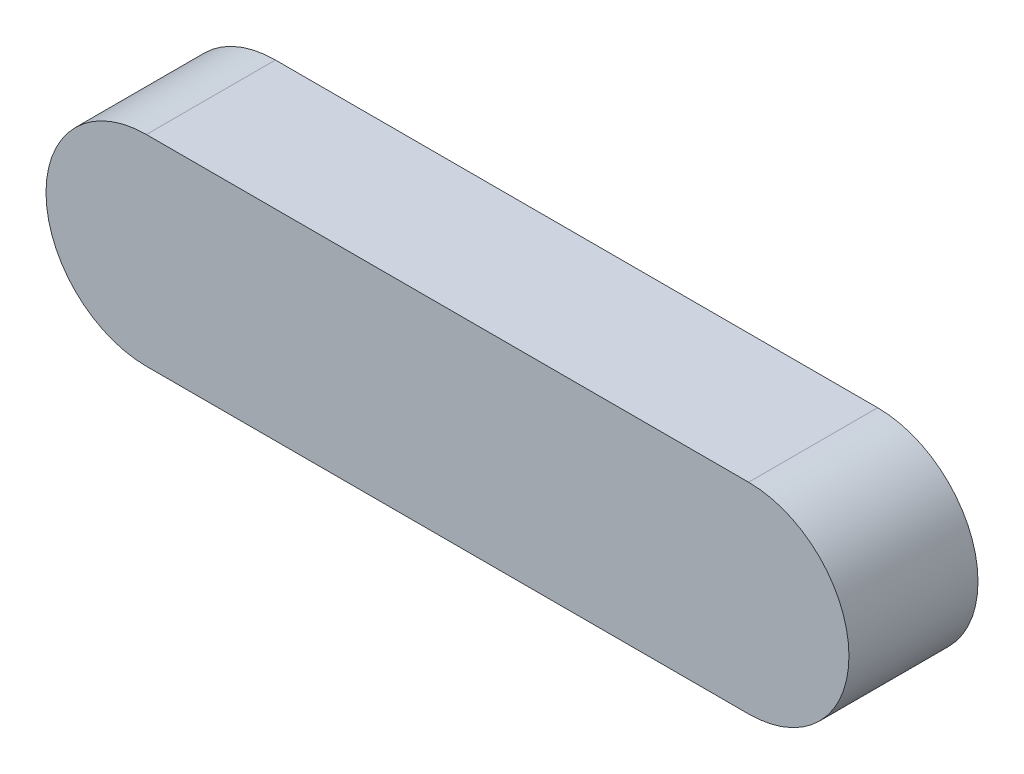
ISO-10303-21;
HEADER;
FILE_DESCRIPTION(('STEP AP214'),'2;1');
FILE_NAME('part.step','',(''),(''),'','','');
FILE_SCHEMA(('AUTOMOTIVE_DESIGN { 1 0 10303 214 1 1 1 1 }'));
ENDSEC;
DATA;
#1=APPLICATION_CONTEXT('core data for automotive mechanical design processes');
#2=APPLICATION_PROTOCOL_DEFINITION('international standard','automotive_design',2000,#1);
#3=PRODUCT_CONTEXT('',#1,'mechanical');
#4=PRODUCT('Part','Part','',(#3));
#5=PRODUCT_RELATED_PRODUCT_CATEGORY('part','',(#4));
#6=PRODUCT_DEFINITION_FORMATION('','',#4);
#7=PRODUCT_DEFINITION_CONTEXT('part definition',#1,'design');
#8=PRODUCT_DEFINITION('design','',#6,#7);
#9=PRODUCT_DEFINITION_SHAPE('','',#8);
#10=(LENGTH_UNIT() NAMED_UNIT(*) SI_UNIT(.MILLI.,.METRE.));
#11=(NAMED_UNIT(*) PLANE_ANGLE_UNIT() SI_UNIT($,.RADIAN.));
#12=(NAMED_UNIT(*) SI_UNIT($,.STERADIAN.) SOLID_ANGLE_UNIT());
#13=UNCERTAINTY_MEASURE_WITH_UNIT(LENGTH_MEASURE(1.E-05),#10,'distance_accuracy_value','');
#14=(GEOMETRIC_REPRESENTATION_CONTEXT(3) GLOBAL_UNCERTAINTY_ASSIGNED_CONTEXT((#13)) GLOBAL_UNIT_ASSIGNED_CONTEXT((#10,
#11,#12)) REPRESENTATION_CONTEXT('',''));
#15=CARTESIAN_POINT('',(0.,0.,0.));
#16=DIRECTION('',(0.,0.,1.));
#17=DIRECTION('',(1.,0.,0.));
#18=AXIS2_PLACEMENT_3D('',#15,#16,#17);
#19=CARTESIAN_POINT('',(-21.,0.,9.));
#20=DIRECTION('',(0.,0.,-1.));
#21=DIRECTION('',(-1.,0.,0.));
#22=AXIS2_PLACEMENT_3D('',#19,#20,#21);
#23=CYLINDRICAL_SURFACE('',#22,7.);
#24=CARTESIAN_POINT('',(-21.,0.,0.));
#25=DIRECTION('',(0.,0.,1.));
#26=DIRECTION('',(1.,0.,0.));
#27=AXIS2_PLACEMENT_3D('',#24,#25,#26);
#28=CIRCLE('',#27,7.);
#29=CARTESIAN_POINT('',(-21.,7.,0.));
#30=VERTEX_POINT('',#29);
#31=CARTESIAN_POINT('',(-21.,-7.,0.));
#32=VERTEX_POINT('',#31);
#33=EDGE_CURVE('E97',#30,#32,#28,.T.);
#34=ORIENTED_EDGE('',*,*,#33,.T.);
#35=DIRECTION('',(0.,0.,-1.));
#36=VECTOR('',#35,1.);
#37=CARTESIAN_POINT('',(-21.,-7.,9.));
#38=LINE('',#37,#36);
#39=CARTESIAN_POINT('',(-21.,-7.,9.));
#40=VERTEX_POINT('',#39);
#41=EDGE_CURVE('E11',#40,#32,#38,.T.);
#42=ORIENTED_EDGE('',*,*,#41,.F.);
#43=CARTESIAN_POINT('',(-21.,0.,9.));
#44=DIRECTION('',(0.,0.,1.));
#45=DIRECTION('',(1.,0.,0.));
#46=AXIS2_PLACEMENT_3D('',#43,#44,#45);
#47=CIRCLE('',#46,7.);
#48=CARTESIAN_POINT('',(-21.,7.,9.));
#49=VERTEX_POINT('',#48);
#50=EDGE_CURVE('E85',#49,#40,#47,.T.);
#51=ORIENTED_EDGE('',*,*,#50,.F.);
#52=DIRECTION('',(0.,0.,-1.));
#53=VECTOR('',#52,1.);
#54=CARTESIAN_POINT('',(-21.,7.,9.));
#55=LINE('',#54,#53);
#56=EDGE_CURVE('E93',#49,#30,#55,.T.);
#57=ORIENTED_EDGE('',*,*,#56,.T.);
#58=EDGE_LOOP('',(#34,#42,#51,#57));
#59=FACE_BOUND('',#58,.T.);
#60=ADVANCED_FACE('F34',(#59),#23,.T.);
#61=CARTESIAN_POINT('',(-21.,-7.,9.));
#62=DIRECTION('',(0.,1.,0.));
#63=DIRECTION('',(0.,0.,1.));
#64=AXIS2_PLACEMENT_3D('',#61,#62,#63);
#65=PLANE('',#64);
#66=DIRECTION('',(1.,0.,0.));
#67=VECTOR('',#66,1.);
#68=CARTESIAN_POINT('',(-21.,-7.,0.));
#69=LINE('',#68,#67);
#70=CARTESIAN_POINT('',(21.,-7.,0.));
#71=VERTEX_POINT('',#70);
#72=EDGE_CURVE('E89',#32,#71,#69,.T.);
#73=ORIENTED_EDGE('',*,*,#72,.T.);
#74=DIRECTION('',(0.,0.,-1.));
#75=VECTOR('',#74,1.);
#76=CARTESIAN_POINT('',(21.,-7.,9.));
#77=LINE('',#76,#75);
#78=CARTESIAN_POINT('',(21.,-7.,9.));
#79=VERTEX_POINT('',#78);
#80=EDGE_CURVE('E42',#79,#71,#77,.T.);
#81=ORIENTED_EDGE('',*,*,#80,.F.);
#82=DIRECTION('',(1.,0.,0.));
#83=VECTOR('',#82,1.);
#84=CARTESIAN_POINT('',(-21.,-7.,9.));
#85=LINE('',#84,#83);
#86=EDGE_CURVE('E80',#40,#79,#85,.T.);
#87=ORIENTED_EDGE('',*,*,#86,.F.);
#88=ORIENTED_EDGE('',*,*,#41,.T.);
#89=EDGE_LOOP('',(#73,#81,#87,#88));
#90=FACE_BOUND('',#89,.T.);
#91=ADVANCED_FACE('F88',(#90),#65,.F.);
#92=CARTESIAN_POINT('',(21.,0.,9.));
#93=DIRECTION('',(0.,0.,-1.));
#94=DIRECTION('',(-1.,0.,0.));
#95=AXIS2_PLACEMENT_3D('',#92,#93,#94);
#96=CYLINDRICAL_SURFACE('',#95,7.);
#97=CARTESIAN_POINT('',(21.,0.,0.));
#98=DIRECTION('',(0.,0.,1.));
#99=DIRECTION('',(1.,0.,0.));
#100=AXIS2_PLACEMENT_3D('',#97,#98,#99);
#101=CIRCLE('',#100,7.);
#102=CARTESIAN_POINT('',(21.,7.,0.));
#103=VERTEX_POINT('',#102);
#104=EDGE_CURVE('E67',#71,#103,#101,.T.);
#105=ORIENTED_EDGE('',*,*,#104,.T.);
#106=DIRECTION('',(0.,0.,-1.));
#107=VECTOR('',#106,1.);
#108=CARTESIAN_POINT('',(21.,7.,9.));
#109=LINE('',#108,#107);
#110=CARTESIAN_POINT('',(21.,7.,9.));
#111=VERTEX_POINT('',#110);
#112=EDGE_CURVE('E90',#111,#103,#109,.T.);
#113=ORIENTED_EDGE('',*,*,#112,.F.);
#114=CARTESIAN_POINT('',(21.,0.,9.));
#115=DIRECTION('',(0.,0.,1.));
#116=DIRECTION('',(1.,0.,0.));
#117=AXIS2_PLACEMENT_3D('',#114,#115,#116);
#118=CIRCLE('',#117,7.);
#119=EDGE_CURVE('E83',#79,#111,#118,.T.);
#120=ORIENTED_EDGE('',*,*,#119,.F.);
#121=ORIENTED_EDGE('',*,*,#80,.T.);
#122=EDGE_LOOP('',(#105,#113,#120,#121));
#123=FACE_BOUND('',#122,.T.);
#124=ADVANCED_FACE('F91',(#123),#96,.T.);
#125=CARTESIAN_POINT('',(-21.,7.,9.));
#126=DIRECTION('',(0.,-1.,0.));
#127=DIRECTION('',(0.,0.,-1.));
#128=AXIS2_PLACEMENT_3D('',#125,#126,#127);
#129=PLANE('',#128);
#130=DIRECTION('',(-1.,0.,0.));
#131=VECTOR('',#130,1.);
#132=CARTESIAN_POINT('',(-21.,7.,0.));
#133=LINE('',#132,#131);
#134=EDGE_CURVE('E73',#103,#30,#133,.T.);
#135=ORIENTED_EDGE('',*,*,#134,.T.);
#136=ORIENTED_EDGE('',*,*,#56,.F.);
#137=DIRECTION('',(-1.,0.,0.));
#138=VECTOR('',#137,1.);
#139=CARTESIAN_POINT('',(-21.,7.,9.));
#140=LINE('',#139,#138);
#141=EDGE_CURVE('E50',#111,#49,#140,.T.);
#142=ORIENTED_EDGE('',*,*,#141,.F.);
#143=ORIENTED_EDGE('',*,*,#112,.T.);
#144=EDGE_LOOP('',(#135,#136,#142,#143));
#145=FACE_BOUND('',#144,.T.);
#146=ADVANCED_FACE('F104',(#145),#129,.F.);
#147=CARTESIAN_POINT('',(-21.,0.,9.));
#148=DIRECTION('',(0.,0.,1.));
#149=DIRECTION('',(1.,0.,0.));
#150=AXIS2_PLACEMENT_3D('',#147,#148,#149);
#151=PLANE('',#150);
#152=ORIENTED_EDGE('',*,*,#50,.T.);
#153=ORIENTED_EDGE('',*,*,#86,.T.);
#154=ORIENTED_EDGE('',*,*,#119,.T.);
#155=ORIENTED_EDGE('',*,*,#141,.T.);
#156=EDGE_LOOP('',(#152,#153,#154,#155));
#157=FACE_BOUND('',#156,.T.);
#158=ADVANCED_FACE('F81',(#157),#151,.T.);
#159=CARTESIAN_POINT('',(-21.,0.,0.));
#160=DIRECTION('',(0.,0.,1.));
#161=DIRECTION('',(1.,0.,0.));
#162=AXIS2_PLACEMENT_3D('',#159,#160,#161);
#163=PLANE('',#162);
#164=ORIENTED_EDGE('',*,*,#33,.F.);
#165=ORIENTED_EDGE('',*,*,#134,.F.);
#166=ORIENTED_EDGE('',*,*,#104,.F.);
#167=ORIENTED_EDGE('',*,*,#72,.F.);
#168=EDGE_LOOP('',(#164,#165,#166,#167));
#169=FACE_BOUND('',#168,.T.);
#170=ADVANCED_FACE('F107',(#169),#163,.F.);
#171=CLOSED_SHELL('',(#60,#91,#124,#146,#158,#170));
#172=MANIFOLD_SOLID_BREP('B2',#171);
#173=ADVANCED_BREP_SHAPE_REPRESENTATION('',(#18,#172),#14);
#174=SHAPE_DEFINITION_REPRESENTATION(#9,#173);
ENDSEC;
END-ISO-10303-21;
